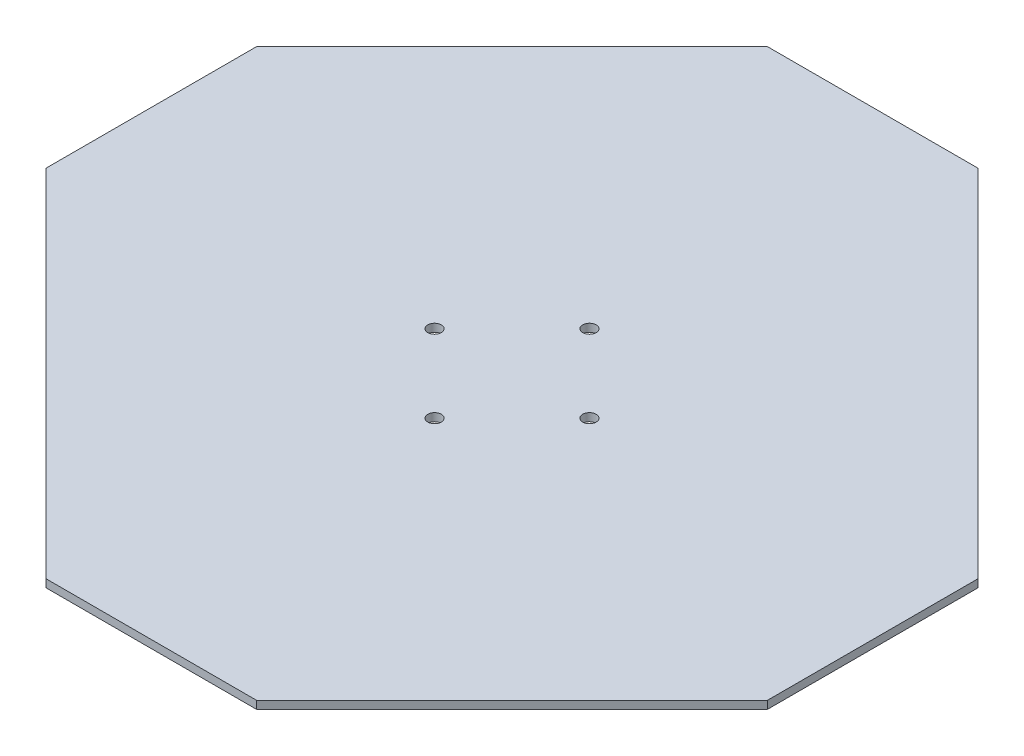
ISO-10303-21;
HEADER;
FILE_DESCRIPTION(('STEP AP214'),'2;1');
FILE_NAME('part.step','',(''),(''),'','','');
FILE_SCHEMA(('AUTOMOTIVE_DESIGN { 1 0 10303 214 1 1 1 1 }'));
ENDSEC;
DATA;
#1=APPLICATION_CONTEXT('core data for automotive mechanical design processes');
#2=APPLICATION_PROTOCOL_DEFINITION('international standard','automotive_design',2000,#1);
#3=PRODUCT_CONTEXT('',#1,'mechanical');
#4=PRODUCT('Part','Part','',(#3));
#5=PRODUCT_RELATED_PRODUCT_CATEGORY('part','',(#4));
#6=PRODUCT_DEFINITION_FORMATION('','',#4);
#7=PRODUCT_DEFINITION_CONTEXT('part definition',#1,'design');
#8=PRODUCT_DEFINITION('design','',#6,#7);
#9=PRODUCT_DEFINITION_SHAPE('','',#8);
#10=(LENGTH_UNIT() NAMED_UNIT(*) SI_UNIT(.MILLI.,.METRE.));
#11=(NAMED_UNIT(*) PLANE_ANGLE_UNIT() SI_UNIT($,.RADIAN.));
#12=(NAMED_UNIT(*) SI_UNIT($,.STERADIAN.) SOLID_ANGLE_UNIT());
#13=UNCERTAINTY_MEASURE_WITH_UNIT(LENGTH_MEASURE(1.E-05),#10,'distance_accuracy_value','');
#14=(GEOMETRIC_REPRESENTATION_CONTEXT(3) GLOBAL_UNCERTAINTY_ASSIGNED_CONTEXT((#13)) GLOBAL_UNIT_ASSIGNED_CONTEXT((#10,
#11,#12)) REPRESENTATION_CONTEXT('',''));
#15=CARTESIAN_POINT('',(0.,0.,0.));
#16=DIRECTION('',(0.,0.,1.));
#17=DIRECTION('',(1.,0.,0.));
#18=AXIS2_PLACEMENT_3D('',#15,#16,#17);
#19=CARTESIAN_POINT('',(0.,0.,0.));
#20=DIRECTION('',(0.,1.,0.));
#21=DIRECTION('',(0.,0.,1.));
#22=AXIS2_PLACEMENT_3D('',#19,#20,#21);
#23=PLANE('',#22);
#24=CARTESIAN_POINT('',(-39.0298070325394,0.,-9.52821254410356));
#25=DIRECTION('',(0.,-1.,0.));
#26=DIRECTION('',(0.,0.,-1.));
#27=AXIS2_PLACEMENT_3D('',#24,#25,#26);
#28=CIRCLE('',#27,2.57975099999998);
#29=CARTESIAN_POINT('',(-39.0298070325394,0.,-12.1079635441035));
#30=VERTEX_POINT('',#29);
#31=EDGE_CURVE('E203',#30,#30,#28,.T.);
#32=ORIENTED_EDGE('',*,*,#31,.F.);
#33=EDGE_LOOP('',(#32));
#34=FACE_BOUND('',#33,.T.);
#35=CARTESIAN_POINT('',(-9.52821254411238,0.,19.970192881282));
#36=DIRECTION('',(0.,-1.,0.));
#37=DIRECTION('',(0.,0.,-1.));
#38=AXIS2_PLACEMENT_3D('',#35,#36,#37);
#39=CIRCLE('',#38,2.57975099999999);
#40=CARTESIAN_POINT('',(-9.52821254411238,0.,17.390441881282));
#41=VERTEX_POINT('',#40);
#42=EDGE_CURVE('E197',#41,#41,#39,.T.);
#43=ORIENTED_EDGE('',*,*,#42,.F.);
#44=EDGE_LOOP('',(#43));
#45=FACE_BOUND('',#44,.T.);
#46=CARTESIAN_POINT('',(-9.53140160714409,0.,-39.0298070325314));
#47=DIRECTION('',(0.,-1.,0.));
#48=DIRECTION('',(0.,0.,-1.));
#49=AXIS2_PLACEMENT_3D('',#46,#47,#48);
#50=CIRCLE('',#49,2.57975099999999);
#51=CARTESIAN_POINT('',(-9.53140160714409,0.,-41.6095580325314));
#52=VERTEX_POINT('',#51);
#53=EDGE_CURVE('E185',#52,#52,#50,.T.);
#54=ORIENTED_EDGE('',*,*,#53,.F.);
#55=EDGE_LOOP('',(#54));
#56=FACE_BOUND('',#55,.T.);
#57=DIRECTION('',(-0.707106781186548,0.,0.707106781186547));
#58=VECTOR('',#57,1.);
#59=CARTESIAN_POINT('',(-68.75,0.,-165.97718241315));
#60=LINE('',#59,#58);
#61=CARTESIAN_POINT('',(-68.75,0.,-165.97718241315));
#62=VERTEX_POINT('',#61);
#63=CARTESIAN_POINT('',(-165.97718241315,0.,-68.7500000000001));
#64=VERTEX_POINT('',#63);
#65=EDGE_CURVE('E135',#62,#64,#60,.T.);
#66=ORIENTED_EDGE('',*,*,#65,.F.);
#67=DIRECTION('',(-1.,0.,0.));
#68=VECTOR('',#67,1.);
#69=CARTESIAN_POINT('',(11.5066196646726,0.,-165.97718241315));
#70=LINE('',#69,#68);
#71=CARTESIAN_POINT('',(11.5066196646726,0.,-165.97718241315));
#72=VERTEX_POINT('',#71);
#73=EDGE_CURVE('E90',#72,#62,#70,.T.);
#74=ORIENTED_EDGE('',*,*,#73,.F.);
#75=DIRECTION('',(-0.707106781186549,0.,-0.707106781186546));
#76=VECTOR('',#75,1.);
#77=CARTESIAN_POINT('',(146.917568261898,0.,-30.566233815926));
#78=LINE('',#77,#76);
#79=CARTESIAN_POINT('',(146.917568261898,0.,-30.566233815926));
#80=VERTEX_POINT('',#79);
#81=EDGE_CURVE('E84',#80,#72,#78,.T.);
#82=ORIENTED_EDGE('',*,*,#81,.F.);
#83=DIRECTION('',(0.,0.,-1.));
#84=VECTOR('',#83,1.);
#85=CARTESIAN_POINT('',(146.917568261898,0.,-30.566233815926));
#86=LINE('',#85,#84);
#87=CARTESIAN_POINT('',(146.917568261898,0.,49.690385848746));
#88=VERTEX_POINT('',#87);
#89=EDGE_CURVE('E125',#88,#80,#86,.T.);
#90=ORIENTED_EDGE('',*,*,#89,.F.);
#91=DIRECTION('',(0.707106781186548,0.,-0.707106781186548));
#92=VECTOR('',#91,1.);
#93=CARTESIAN_POINT('',(49.6903858487474,0.,146.917568261896));
#94=LINE('',#93,#92);
#95=CARTESIAN_POINT('',(49.6903858487474,0.,146.917568261896));
#96=VERTEX_POINT('',#95);
#97=EDGE_CURVE('E145',#96,#88,#94,.T.);
#98=ORIENTED_EDGE('',*,*,#97,.F.);
#99=DIRECTION('',(1.,0.,0.));
#100=VECTOR('',#99,1.);
#101=CARTESIAN_POINT('',(49.6903858487474,0.,146.917568261896));
#102=LINE('',#101,#100);
#103=CARTESIAN_POINT('',(-30.5662338159264,0.,146.917568261896));
#104=VERTEX_POINT('',#103);
#105=EDGE_CURVE('E143',#104,#96,#102,.T.);
#106=ORIENTED_EDGE('',*,*,#105,.F.);
#107=DIRECTION('',(0.707106781186551,0.,0.707106781186544));
#108=VECTOR('',#107,1.);
#109=CARTESIAN_POINT('',(-165.97718241315,0.,11.5066196646739));
#110=LINE('',#109,#108);
#111=CARTESIAN_POINT('',(-165.97718241315,0.,11.5066196646739));
#112=VERTEX_POINT('',#111);
#113=EDGE_CURVE('E141',#112,#104,#110,.T.);
#114=ORIENTED_EDGE('',*,*,#113,.F.);
#115=DIRECTION('',(0.,0.,1.));
#116=VECTOR('',#115,1.);
#117=CARTESIAN_POINT('',(-165.97718241315,0.,-68.7500000000001));
#118=LINE('',#117,#116);
#119=EDGE_CURVE('E138',#64,#112,#118,.T.);
#120=ORIENTED_EDGE('',*,*,#119,.F.);
#121=EDGE_LOOP('',(#66,#74,#82,#90,#98,#106,#114,#120));
#122=FACE_BOUND('',#121,.T.);
#123=CARTESIAN_POINT('',(19.9701928812739,0.,-9.53140160713692));
#124=DIRECTION('',(0.,-1.,0.));
#125=DIRECTION('',(0.,0.,-1.));
#126=AXIS2_PLACEMENT_3D('',#123,#124,#125);
#127=CIRCLE('',#126,2.57975099999999);
#128=CARTESIAN_POINT('',(19.9701928812739,0.,-12.1111526071369));
#129=VERTEX_POINT('',#128);
#130=EDGE_CURVE('E191',#129,#129,#127,.T.);
#131=ORIENTED_EDGE('',*,*,#130,.F.);
#132=EDGE_LOOP('',(#131));
#133=FACE_BOUND('',#132,.T.);
#134=ADVANCED_FACE('F38',(#34,#45,#56,#122,#133),#23,.F.);
#135=CARTESIAN_POINT('',(-68.75,3.,-165.97718241315));
#136=DIRECTION('',(0.707106781186547,0.,0.707106781186548));
#137=DIRECTION('',(0.707106781186548,0.,-0.707106781186547));
#138=AXIS2_PLACEMENT_3D('',#135,#136,#137);
#139=PLANE('',#138);
#140=ORIENTED_EDGE('',*,*,#65,.T.);
#141=DIRECTION('',(0.,-1.,0.));
#142=VECTOR('',#141,1.);
#143=CARTESIAN_POINT('',(-165.97718241315,3.,-68.7500000000001));
#144=LINE('',#143,#142);
#145=CARTESIAN_POINT('',(-165.97718241315,3.,-68.7500000000001));
#146=VERTEX_POINT('',#145);
#147=EDGE_CURVE('E11',#146,#64,#144,.T.);
#148=ORIENTED_EDGE('',*,*,#147,.F.);
#149=DIRECTION('',(-0.707106781186548,0.,0.707106781186547));
#150=VECTOR('',#149,1.);
#151=CARTESIAN_POINT('',(-68.75,3.,-165.97718241315));
#152=LINE('',#151,#150);
#153=CARTESIAN_POINT('',(-68.75,3.,-165.97718241315));
#154=VERTEX_POINT('',#153);
#155=EDGE_CURVE('E150',#154,#146,#152,.T.);
#156=ORIENTED_EDGE('',*,*,#155,.F.);
#157=DIRECTION('',(0.,-1.,0.));
#158=VECTOR('',#157,1.);
#159=CARTESIAN_POINT('',(-68.75,3.,-165.97718241315));
#160=LINE('',#159,#158);
#161=EDGE_CURVE('E131',#154,#62,#160,.T.);
#162=ORIENTED_EDGE('',*,*,#161,.T.);
#163=EDGE_LOOP('',(#140,#148,#156,#162));
#164=FACE_BOUND('',#163,.T.);
#165=ADVANCED_FACE('F40',(#164),#139,.F.);
#166=CARTESIAN_POINT('',(-165.97718241315,3.,-68.7500000000001));
#167=DIRECTION('',(1.,0.,0.));
#168=DIRECTION('',(0.,0.,-1.));
#169=AXIS2_PLACEMENT_3D('',#166,#167,#168);
#170=PLANE('',#169);
#171=ORIENTED_EDGE('',*,*,#119,.T.);
#172=DIRECTION('',(0.,-1.,0.));
#173=VECTOR('',#172,1.);
#174=CARTESIAN_POINT('',(-165.97718241315,3.,11.5066196646739));
#175=LINE('',#174,#173);
#176=CARTESIAN_POINT('',(-165.97718241315,3.,11.5066196646739));
#177=VERTEX_POINT('',#176);
#178=EDGE_CURVE('E47',#177,#112,#175,.T.);
#179=ORIENTED_EDGE('',*,*,#178,.F.);
#180=DIRECTION('',(0.,0.,1.));
#181=VECTOR('',#180,1.);
#182=CARTESIAN_POINT('',(-165.97718241315,3.,-68.7500000000001));
#183=LINE('',#182,#181);
#184=EDGE_CURVE('E98',#146,#177,#183,.T.);
#185=ORIENTED_EDGE('',*,*,#184,.F.);
#186=ORIENTED_EDGE('',*,*,#147,.T.);
#187=EDGE_LOOP('',(#171,#179,#185,#186));
#188=FACE_BOUND('',#187,.T.);
#189=ADVANCED_FACE('F246',(#188),#170,.F.);
#190=CARTESIAN_POINT('',(-165.97718241315,3.,11.5066196646739));
#191=DIRECTION('',(0.707106781186544,0.,-0.707106781186551));
#192=DIRECTION('',(-0.707106781186551,0.,-0.707106781186544));
#193=AXIS2_PLACEMENT_3D('',#190,#191,#192);
#194=PLANE('',#193);
#195=ORIENTED_EDGE('',*,*,#113,.T.);
#196=DIRECTION('',(0.,-1.,0.));
#197=VECTOR('',#196,1.);
#198=CARTESIAN_POINT('',(-30.5662338159264,3.,146.917568261896));
#199=LINE('',#198,#197);
#200=CARTESIAN_POINT('',(-30.5662338159264,3.,146.917568261896));
#201=VERTEX_POINT('',#200);
#202=EDGE_CURVE('E157',#201,#104,#199,.T.);
#203=ORIENTED_EDGE('',*,*,#202,.F.);
#204=DIRECTION('',(0.707106781186551,0.,0.707106781186544));
#205=VECTOR('',#204,1.);
#206=CARTESIAN_POINT('',(-165.97718241315,3.,11.5066196646739));
#207=LINE('',#206,#205);
#208=EDGE_CURVE('E165',#177,#201,#207,.T.);
#209=ORIENTED_EDGE('',*,*,#208,.F.);
#210=ORIENTED_EDGE('',*,*,#178,.T.);
#211=EDGE_LOOP('',(#195,#203,#209,#210));
#212=FACE_BOUND('',#211,.T.);
#213=ADVANCED_FACE('F163',(#212),#194,.F.);
#214=CARTESIAN_POINT('',(49.6903858487474,3.,146.917568261896));
#215=DIRECTION('',(0.,0.,-1.));
#216=DIRECTION('',(-1.,0.,0.));
#217=AXIS2_PLACEMENT_3D('',#214,#215,#216);
#218=PLANE('',#217);
#219=ORIENTED_EDGE('',*,*,#105,.T.);
#220=DIRECTION('',(0.,-1.,0.));
#221=VECTOR('',#220,1.);
#222=CARTESIAN_POINT('',(49.6903858487474,3.,146.917568261896));
#223=LINE('',#222,#221);
#224=CARTESIAN_POINT('',(49.6903858487474,3.,146.917568261896));
#225=VERTEX_POINT('',#224);
#226=EDGE_CURVE('E154',#225,#96,#223,.T.);
#227=ORIENTED_EDGE('',*,*,#226,.F.);
#228=DIRECTION('',(1.,0.,0.));
#229=VECTOR('',#228,1.);
#230=CARTESIAN_POINT('',(49.6903858487474,3.,146.917568261896));
#231=LINE('',#230,#229);
#232=EDGE_CURVE('E177',#201,#225,#231,.T.);
#233=ORIENTED_EDGE('',*,*,#232,.F.);
#234=ORIENTED_EDGE('',*,*,#202,.T.);
#235=EDGE_LOOP('',(#219,#227,#233,#234));
#236=FACE_BOUND('',#235,.T.);
#237=ADVANCED_FACE('F173',(#236),#218,.F.);
#238=CARTESIAN_POINT('',(49.6903858487474,3.,146.917568261896));
#239=DIRECTION('',(-0.707106781186547,0.,-0.707106781186547));
#240=DIRECTION('',(-0.707106781186548,0.,0.707106781186548));
#241=AXIS2_PLACEMENT_3D('',#238,#239,#240);
#242=PLANE('',#241);
#243=ORIENTED_EDGE('',*,*,#97,.T.);
#244=DIRECTION('',(0.,-1.,0.));
#245=VECTOR('',#244,1.);
#246=CARTESIAN_POINT('',(146.917568261898,3.,49.690385848746));
#247=LINE('',#246,#245);
#248=CARTESIAN_POINT('',(146.917568261898,3.,49.690385848746));
#249=VERTEX_POINT('',#248);
#250=EDGE_CURVE('E126',#249,#88,#247,.T.);
#251=ORIENTED_EDGE('',*,*,#250,.F.);
#252=DIRECTION('',(0.707106781186548,0.,-0.707106781186548));
#253=VECTOR('',#252,1.);
#254=CARTESIAN_POINT('',(49.6903858487474,3.,146.917568261896));
#255=LINE('',#254,#253);
#256=EDGE_CURVE('E117',#225,#249,#255,.T.);
#257=ORIENTED_EDGE('',*,*,#256,.F.);
#258=ORIENTED_EDGE('',*,*,#226,.T.);
#259=EDGE_LOOP('',(#243,#251,#257,#258));
#260=FACE_BOUND('',#259,.T.);
#261=ADVANCED_FACE('F176',(#260),#242,.F.);
#262=CARTESIAN_POINT('',(146.917568261898,3.,-30.566233815926));
#263=DIRECTION('',(-1.,0.,0.));
#264=DIRECTION('',(0.,0.,1.));
#265=AXIS2_PLACEMENT_3D('',#262,#263,#264);
#266=PLANE('',#265);
#267=ORIENTED_EDGE('',*,*,#89,.T.);
#268=DIRECTION('',(0.,-1.,0.));
#269=VECTOR('',#268,1.);
#270=CARTESIAN_POINT('',(146.917568261898,3.,-30.566233815926));
#271=LINE('',#270,#269);
#272=CARTESIAN_POINT('',(146.917568261898,3.,-30.566233815926));
#273=VERTEX_POINT('',#272);
#274=EDGE_CURVE('E122',#273,#80,#271,.T.);
#275=ORIENTED_EDGE('',*,*,#274,.F.);
#276=DIRECTION('',(0.,0.,-1.));
#277=VECTOR('',#276,1.);
#278=CARTESIAN_POINT('',(146.917568261898,3.,-30.566233815926));
#279=LINE('',#278,#277);
#280=EDGE_CURVE('E111',#249,#273,#279,.T.);
#281=ORIENTED_EDGE('',*,*,#280,.F.);
#282=ORIENTED_EDGE('',*,*,#250,.T.);
#283=EDGE_LOOP('',(#267,#275,#281,#282));
#284=FACE_BOUND('',#283,.T.);
#285=ADVANCED_FACE('F123',(#284),#266,.F.);
#286=CARTESIAN_POINT('',(146.917568261898,3.,-30.566233815926));
#287=DIRECTION('',(-0.707106781186545,0.,0.707106781186549));
#288=DIRECTION('',(0.707106781186549,0.,0.707106781186546));
#289=AXIS2_PLACEMENT_3D('',#286,#287,#288);
#290=PLANE('',#289);
#291=ORIENTED_EDGE('',*,*,#81,.T.);
#292=DIRECTION('',(0.,-1.,0.));
#293=VECTOR('',#292,1.);
#294=CARTESIAN_POINT('',(11.5066196646726,3.,-165.97718241315));
#295=LINE('',#294,#293);
#296=CARTESIAN_POINT('',(11.5066196646726,3.,-165.97718241315));
#297=VERTEX_POINT('',#296);
#298=EDGE_CURVE('E127',#297,#72,#295,.T.);
#299=ORIENTED_EDGE('',*,*,#298,.F.);
#300=DIRECTION('',(-0.707106781186549,0.,-0.707106781186546));
#301=VECTOR('',#300,1.);
#302=CARTESIAN_POINT('',(146.917568261898,3.,-30.566233815926));
#303=LINE('',#302,#301);
#304=EDGE_CURVE('E115',#273,#297,#303,.T.);
#305=ORIENTED_EDGE('',*,*,#304,.F.);
#306=ORIENTED_EDGE('',*,*,#274,.T.);
#307=EDGE_LOOP('',(#291,#299,#305,#306));
#308=FACE_BOUND('',#307,.T.);
#309=ADVANCED_FACE('F129',(#308),#290,.F.);
#310=CARTESIAN_POINT('',(11.5066196646726,3.,-165.97718241315));
#311=DIRECTION('',(0.,0.,1.));
#312=DIRECTION('',(1.,0.,0.));
#313=AXIS2_PLACEMENT_3D('',#310,#311,#312);
#314=PLANE('',#313);
#315=ORIENTED_EDGE('',*,*,#73,.T.);
#316=ORIENTED_EDGE('',*,*,#161,.F.);
#317=DIRECTION('',(-1.,0.,0.));
#318=VECTOR('',#317,1.);
#319=CARTESIAN_POINT('',(11.5066196646726,3.,-165.97718241315));
#320=LINE('',#319,#318);
#321=EDGE_CURVE('E55',#297,#154,#320,.T.);
#322=ORIENTED_EDGE('',*,*,#321,.F.);
#323=ORIENTED_EDGE('',*,*,#298,.T.);
#324=EDGE_LOOP('',(#315,#316,#322,#323));
#325=FACE_BOUND('',#324,.T.);
#326=ADVANCED_FACE('F225',(#325),#314,.F.);
#327=CARTESIAN_POINT('',(0.,3.,0.));
#328=DIRECTION('',(0.,1.,0.));
#329=DIRECTION('',(0.,0.,1.));
#330=AXIS2_PLACEMENT_3D('',#327,#328,#329);
#331=PLANE('',#330);
#332=CARTESIAN_POINT('',(-39.0298070325394,3.,-9.52821254410356));
#333=DIRECTION('',(0.,1.,0.));
#334=DIRECTION('',(0.,0.,1.));
#335=AXIS2_PLACEMENT_3D('',#332,#333,#334);
#336=CIRCLE('',#335,2.57975099999999);
#337=CARTESIAN_POINT('',(-39.0298070325394,3.,-6.94846154410357));
#338=VERTEX_POINT('',#337);
#339=EDGE_CURVE('E200',#338,#338,#336,.T.);
#340=ORIENTED_EDGE('',*,*,#339,.F.);
#341=EDGE_LOOP('',(#340));
#342=FACE_BOUND('',#341,.T.);
#343=CARTESIAN_POINT('',(-9.52821254411238,3.,19.970192881282));
#344=DIRECTION('',(0.,1.,0.));
#345=DIRECTION('',(0.,0.,1.));
#346=AXIS2_PLACEMENT_3D('',#343,#344,#345);
#347=CIRCLE('',#346,2.57975099999999);
#348=CARTESIAN_POINT('',(-9.52821254411238,3.,22.549943881282));
#349=VERTEX_POINT('',#348);
#350=EDGE_CURVE('E194',#349,#349,#347,.T.);
#351=ORIENTED_EDGE('',*,*,#350,.F.);
#352=EDGE_LOOP('',(#351));
#353=FACE_BOUND('',#352,.T.);
#354=CARTESIAN_POINT('',(19.9701928812739,3.,-9.53140160713692));
#355=DIRECTION('',(0.,1.,0.));
#356=DIRECTION('',(0.,0.,1.));
#357=AXIS2_PLACEMENT_3D('',#354,#355,#356);
#358=CIRCLE('',#357,2.57975099999999);
#359=CARTESIAN_POINT('',(19.9701928812739,3.,-6.95165060713693));
#360=VERTEX_POINT('',#359);
#361=EDGE_CURVE('E188',#360,#360,#358,.T.);
#362=ORIENTED_EDGE('',*,*,#361,.F.);
#363=EDGE_LOOP('',(#362));
#364=FACE_BOUND('',#363,.T.);
#365=CARTESIAN_POINT('',(-9.53140160714409,3.,-39.0298070325314));
#366=DIRECTION('',(0.,1.,0.));
#367=DIRECTION('',(0.,0.,1.));
#368=AXIS2_PLACEMENT_3D('',#365,#366,#367);
#369=CIRCLE('',#368,2.57975099999999);
#370=CARTESIAN_POINT('',(-9.53140160714409,3.,-36.4500560325314));
#371=VERTEX_POINT('',#370);
#372=EDGE_CURVE('E139',#371,#371,#369,.T.);
#373=ORIENTED_EDGE('',*,*,#372,.F.);
#374=EDGE_LOOP('',(#373));
#375=FACE_BOUND('',#374,.T.);
#376=ORIENTED_EDGE('',*,*,#155,.T.);
#377=ORIENTED_EDGE('',*,*,#184,.T.);
#378=ORIENTED_EDGE('',*,*,#208,.T.);
#379=ORIENTED_EDGE('',*,*,#232,.T.);
#380=ORIENTED_EDGE('',*,*,#256,.T.);
#381=ORIENTED_EDGE('',*,*,#280,.T.);
#382=ORIENTED_EDGE('',*,*,#304,.T.);
#383=ORIENTED_EDGE('',*,*,#321,.T.);
#384=EDGE_LOOP('',(#376,#377,#378,#379,#380,#381,#382,#383));
#385=FACE_BOUND('',#384,.T.);
#386=ADVANCED_FACE('F113',(#342,#353,#364,#375,#385),#331,.T.);
#387=CARTESIAN_POINT('',(-9.53140160714409,0.,-39.0298070325314));
#388=DIRECTION('',(0.,-1.,0.));
#389=DIRECTION('',(0.,0.,-1.));
#390=AXIS2_PLACEMENT_3D('',#387,#388,#389);
#391=CYLINDRICAL_SURFACE('',#390,2.57975099999999);
#392=ORIENTED_EDGE('',*,*,#53,.T.);
#393=EDGE_LOOP('',(#392));
#394=FACE_BOUND('',#393,.T.);
#395=ORIENTED_EDGE('',*,*,#372,.T.);
#396=EDGE_LOOP('',(#395));
#397=FACE_BOUND('',#396,.T.);
#398=ADVANCED_FACE('F217',(#394,#397),#391,.F.);
#399=CARTESIAN_POINT('',(19.9701928812739,0.,-9.53140160713692));
#400=DIRECTION('',(0.,-1.,0.));
#401=DIRECTION('',(0.,0.,-1.));
#402=AXIS2_PLACEMENT_3D('',#399,#400,#401);
#403=CYLINDRICAL_SURFACE('',#402,2.57975099999999);
#404=ORIENTED_EDGE('',*,*,#130,.T.);
#405=EDGE_LOOP('',(#404));
#406=FACE_BOUND('',#405,.T.);
#407=ORIENTED_EDGE('',*,*,#361,.T.);
#408=EDGE_LOOP('',(#407));
#409=FACE_BOUND('',#408,.T.);
#410=ADVANCED_FACE('F220',(#406,#409),#403,.F.);
#411=CARTESIAN_POINT('',(-9.52821254411238,0.,19.970192881282));
#412=DIRECTION('',(0.,-1.,0.));
#413=DIRECTION('',(0.,0.,-1.));
#414=AXIS2_PLACEMENT_3D('',#411,#412,#413);
#415=CYLINDRICAL_SURFACE('',#414,2.57975099999999);
#416=ORIENTED_EDGE('',*,*,#42,.T.);
#417=EDGE_LOOP('',(#416));
#418=FACE_BOUND('',#417,.T.);
#419=ORIENTED_EDGE('',*,*,#350,.T.);
#420=EDGE_LOOP('',(#419));
#421=FACE_BOUND('',#420,.T.);
#422=ADVANCED_FACE('F319',(#418,#421),#415,.F.);
#423=CARTESIAN_POINT('',(-39.0298070325394,0.,-9.52821254410356));
#424=DIRECTION('',(0.,-1.,0.));
#425=DIRECTION('',(0.,0.,-1.));
#426=AXIS2_PLACEMENT_3D('',#423,#424,#425);
#427=CYLINDRICAL_SURFACE('',#426,2.57975099999999);
#428=ORIENTED_EDGE('',*,*,#31,.T.);
#429=EDGE_LOOP('',(#428));
#430=FACE_BOUND('',#429,.T.);
#431=ORIENTED_EDGE('',*,*,#339,.T.);
#432=EDGE_LOOP('',(#431));
#433=FACE_BOUND('',#432,.T.);
#434=ADVANCED_FACE('F207',(#430,#433),#427,.F.);
#435=CLOSED_SHELL('',(#134,#165,#189,#213,#237,#261,#285,#309,#326,#386,#398,#410,#422,#434));
#436=MANIFOLD_SOLID_BREP('B2',#435);
#437=ADVANCED_BREP_SHAPE_REPRESENTATION('',(#18,#436),#14);
#438=SHAPE_DEFINITION_REPRESENTATION(#9,#437);
ENDSEC;
END-ISO-10303-21;
